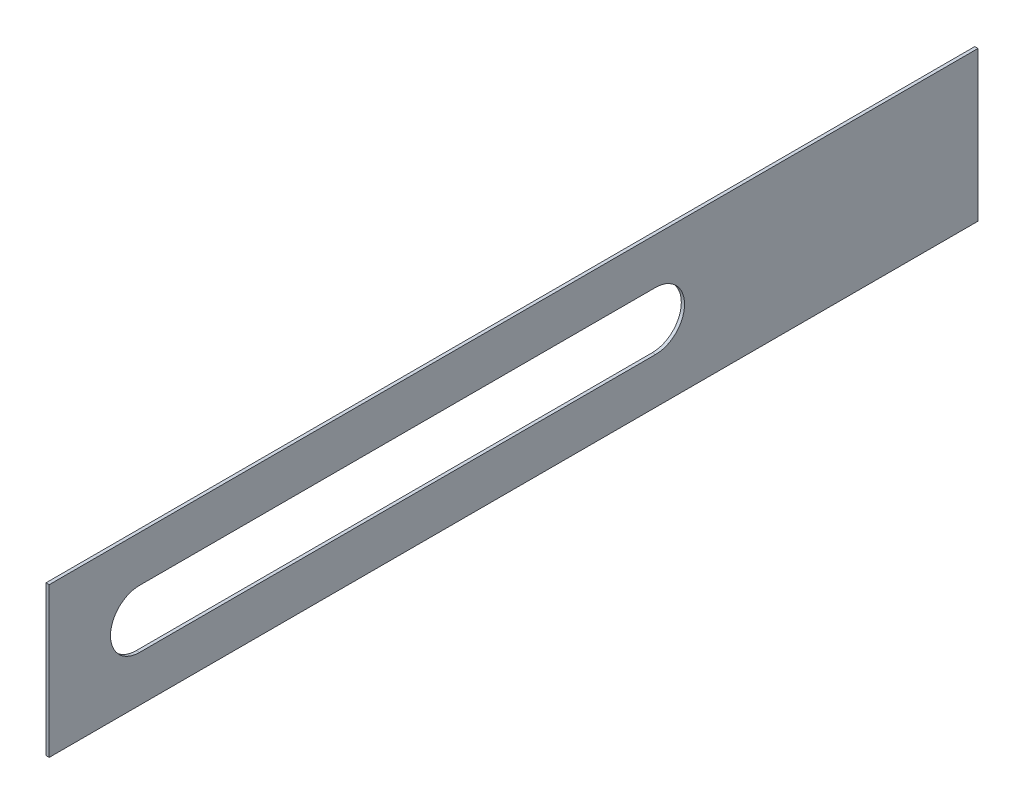
ISO-10303-21;
HEADER;
FILE_DESCRIPTION(('STEP AP214'),'2;1');
FILE_NAME('part.step','',(''),(''),'','','');
FILE_SCHEMA(('AUTOMOTIVE_DESIGN { 1 0 10303 214 1 1 1 1 }'));
ENDSEC;
DATA;
#1=APPLICATION_CONTEXT('core data for automotive mechanical design processes');
#2=APPLICATION_PROTOCOL_DEFINITION('international standard','automotive_design',2000,#1);
#3=PRODUCT_CONTEXT('',#1,'mechanical');
#4=PRODUCT('Part','Part','',(#3));
#5=PRODUCT_RELATED_PRODUCT_CATEGORY('part','',(#4));
#6=PRODUCT_DEFINITION_FORMATION('','',#4);
#7=PRODUCT_DEFINITION_CONTEXT('part definition',#1,'design');
#8=PRODUCT_DEFINITION('design','',#6,#7);
#9=PRODUCT_DEFINITION_SHAPE('','',#8);
#10=(LENGTH_UNIT() NAMED_UNIT(*) SI_UNIT(.MILLI.,.METRE.));
#11=(NAMED_UNIT(*) PLANE_ANGLE_UNIT() SI_UNIT($,.RADIAN.));
#12=(NAMED_UNIT(*) SI_UNIT($,.STERADIAN.) SOLID_ANGLE_UNIT());
#13=UNCERTAINTY_MEASURE_WITH_UNIT(LENGTH_MEASURE(1.E-05),#10,'distance_accuracy_value','');
#14=(GEOMETRIC_REPRESENTATION_CONTEXT(3) GLOBAL_UNCERTAINTY_ASSIGNED_CONTEXT((#13)) GLOBAL_UNIT_ASSIGNED_CONTEXT((#10,
#11,#12)) REPRESENTATION_CONTEXT('',''));
#15=CARTESIAN_POINT('',(0.,0.,0.));
#16=DIRECTION('',(0.,0.,1.));
#17=DIRECTION('',(1.,0.,0.));
#18=AXIS2_PLACEMENT_3D('',#15,#16,#17);
#19=CARTESIAN_POINT('',(255.16572497106,-1.32005517627934E-10,914.4));
#20=DIRECTION('',(1.,0.,0.));
#21=DIRECTION('',(0.,0.,-1.));
#22=AXIS2_PLACEMENT_3D('',#19,#20,#21);
#23=PLANE('',#22);
#24=CARTESIAN_POINT('',(255.16572497105,9.67586371213278E-11,635.));
#25=DIRECTION('',(-1.,0.,0.));
#26=DIRECTION('',(0.,0.,1.));
#27=AXIS2_PLACEMENT_3D('',#24,#25,#26);
#28=CIRCLE('',#27,57.15);
#29=CARTESIAN_POINT('',(255.16572497105,-57.1499999998984,635.));
#30=VERTEX_POINT('',#29);
#31=CARTESIAN_POINT('',(255.16572497105,57.1500000001016,635.000000000127));
#32=VERTEX_POINT('',#31);
#33=EDGE_CURVE('E19',#30,#32,#28,.F.);
#34=ORIENTED_EDGE('',*,*,#33,.T.);
#35=DIRECTION('',(0.,0.,1.));
#36=VECTOR('',#35,1.);
#37=CARTESIAN_POINT('',(255.16572497105,57.1500000001016,1084.10073280334));
#38=LINE('',#37,#36);
#39=CARTESIAN_POINT('',(255.165724971192,57.1500000001016,1650.99999999987));
#40=VERTEX_POINT('',#39);
#41=EDGE_CURVE('E100',#32,#40,#38,.T.);
#42=ORIENTED_EDGE('',*,*,#41,.T.);
#43=CARTESIAN_POINT('',(255.165724971334,9.64299345429456E-11,1651.));
#44=DIRECTION('',(-1.,0.,0.));
#45=DIRECTION('',(0.,0.,1.));
#46=AXIS2_PLACEMENT_3D('',#43,#44,#45);
#47=CIRCLE('',#46,57.15);
#48=CARTESIAN_POINT('',(255.165724971192,-57.1499999998997,1651.));
#49=VERTEX_POINT('',#48);
#50=EDGE_CURVE('E115',#40,#49,#47,.F.);
#51=ORIENTED_EDGE('',*,*,#50,.T.);
#52=DIRECTION('',(0.,0.,1.));
#53=VECTOR('',#52,1.);
#54=CARTESIAN_POINT('',(255.16572497105,-57.1499999998984,1084.10073280334));
#55=LINE('',#54,#53);
#56=EDGE_CURVE('E105',#30,#49,#55,.T.);
#57=ORIENTED_EDGE('',*,*,#56,.F.);
#58=EDGE_LOOP('',(#34,#42,#51,#57));
#59=FACE_BOUND('',#58,.T.);
#60=DIRECTION('',(0.,1.,0.));
#61=VECTOR('',#60,1.);
#62=CARTESIAN_POINT('',(255.16572497106,-500000.000000032,1828.8));
#63=LINE('',#62,#61);
#64=CARTESIAN_POINT('',(255.16572497106,147.319999999976,1828.8));
#65=VERTEX_POINT('',#64);
#66=CARTESIAN_POINT('',(255.16572497106,-147.32000000008,1828.8));
#67=VERTEX_POINT('',#66);
#68=EDGE_CURVE('E131',#65,#67,#63,.F.);
#69=ORIENTED_EDGE('',*,*,#68,.F.);
#70=DIRECTION('',(0.,0.,1.));
#71=VECTOR('',#70,1.);
#72=CARTESIAN_POINT('',(255.16572497106,147.319999999975,1808.3229528099));
#73=LINE('',#72,#71);
#74=CARTESIAN_POINT('',(255.16572497106,147.319999999975,0.));
#75=VERTEX_POINT('',#74);
#76=EDGE_CURVE('E88',#75,#65,#73,.T.);
#77=ORIENTED_EDGE('',*,*,#76,.F.);
#78=DIRECTION('',(0.,1.,0.));
#79=VECTOR('',#78,1.);
#80=CARTESIAN_POINT('',(255.16572497106,21.4565362286324,0.));
#81=LINE('',#80,#79);
#82=CARTESIAN_POINT('',(255.16572497106,-147.320000000057,0.));
#83=VERTEX_POINT('',#82);
#84=EDGE_CURVE('E86',#75,#83,#81,.F.);
#85=ORIENTED_EDGE('',*,*,#84,.T.);
#86=DIRECTION('',(0.,0.,1.));
#87=VECTOR('',#86,1.);
#88=CARTESIAN_POINT('',(255.16572497106,-147.320000000025,1808.3229528099));
#89=LINE('',#88,#87);
#90=EDGE_CURVE('E65',#83,#67,#89,.T.);
#91=ORIENTED_EDGE('',*,*,#90,.T.);
#92=EDGE_LOOP('',(#69,#77,#85,#91));
#93=FACE_BOUND('',#92,.T.);
#94=ADVANCED_FACE('F16',(#59,#93),#23,.F.);
#95=CARTESIAN_POINT('',(261.51572497106,-147.320000000025,1808.3229528099));
#96=DIRECTION('',(0.,1.,0.));
#97=DIRECTION('',(0.,0.,1.));
#98=AXIS2_PLACEMENT_3D('',#95,#96,#97);
#99=PLANE('',#98);
#100=DIRECTION('',(1.,0.,0.));
#101=VECTOR('',#100,1.);
#102=CARTESIAN_POINT('',(261.51572497106,-147.320000000076,0.));
#103=LINE('',#102,#101);
#104=CARTESIAN_POINT('',(261.51572497106,-147.320000000044,0.));
#105=VERTEX_POINT('',#104);
#106=EDGE_CURVE('E79',#83,#105,#103,.T.);
#107=ORIENTED_EDGE('',*,*,#106,.T.);
#108=DIRECTION('',(0.,0.,-1.));
#109=VECTOR('',#108,1.);
#110=CARTESIAN_POINT('',(261.51572497106,-147.320000000051,914.4));
#111=LINE('',#110,#109);
#112=CARTESIAN_POINT('',(261.51572497106,-147.320000000049,1828.8));
#113=VERTEX_POINT('',#112);
#114=EDGE_CURVE('E103',#113,#105,#111,.T.);
#115=ORIENTED_EDGE('',*,*,#114,.F.);
#116=DIRECTION('',(1.,0.,0.));
#117=VECTOR('',#116,1.);
#118=CARTESIAN_POINT('',(261.515724970552,-147.320000000093,1828.8));
#119=LINE('',#118,#117);
#120=EDGE_CURVE('E82',#67,#113,#119,.T.);
#121=ORIENTED_EDGE('',*,*,#120,.F.);
#122=ORIENTED_EDGE('',*,*,#90,.F.);
#123=EDGE_LOOP('',(#107,#115,#121,#122));
#124=FACE_BOUND('',#123,.T.);
#125=ADVANCED_FACE('F75',(#124),#99,.F.);
#126=CARTESIAN_POINT('',(261.51572497106,21.4565362286324,0.));
#127=DIRECTION('',(0.,0.,1.));
#128=DIRECTION('',(1.,0.,0.));
#129=AXIS2_PLACEMENT_3D('',#126,#127,#128);
#130=PLANE('',#129);
#131=DIRECTION('',(1.,0.,0.));
#132=VECTOR('',#131,1.);
#133=CARTESIAN_POINT('',(261.51572497106,147.319999999975,0.));
#134=LINE('',#133,#132);
#135=CARTESIAN_POINT('',(261.51572497106,147.319999999975,0.));
#136=VERTEX_POINT('',#135);
#137=EDGE_CURVE('E133',#136,#75,#134,.F.);
#138=ORIENTED_EDGE('',*,*,#137,.F.);
#139=DIRECTION('',(0.,1.,0.));
#140=VECTOR('',#139,1.);
#141=CARTESIAN_POINT('',(261.51572497106,-1.32019395415748E-10,0.));
#142=LINE('',#141,#140);
#143=EDGE_CURVE('E95',#105,#136,#142,.T.);
#144=ORIENTED_EDGE('',*,*,#143,.F.);
#145=ORIENTED_EDGE('',*,*,#106,.F.);
#146=ORIENTED_EDGE('',*,*,#84,.F.);
#147=EDGE_LOOP('',(#138,#144,#145,#146));
#148=FACE_BOUND('',#147,.T.);
#149=ADVANCED_FACE('F93',(#148),#130,.F.);
#150=CARTESIAN_POINT('',(261.51572497106,147.319999999975,1808.3229528099));
#151=DIRECTION('',(0.,1.,0.));
#152=DIRECTION('',(0.,0.,1.));
#153=AXIS2_PLACEMENT_3D('',#150,#151,#152);
#154=PLANE('',#153);
#155=DIRECTION('',(0.,0.,-1.));
#156=VECTOR('',#155,1.);
#157=CARTESIAN_POINT('',(261.51572497106,147.319999999975,914.4));
#158=LINE('',#157,#156);
#159=CARTESIAN_POINT('',(261.51572497106,147.319999999976,1828.8));
#160=VERTEX_POINT('',#159);
#161=EDGE_CURVE('E147',#136,#160,#158,.F.);
#162=ORIENTED_EDGE('',*,*,#161,.F.);
#163=ORIENTED_EDGE('',*,*,#137,.T.);
#164=ORIENTED_EDGE('',*,*,#76,.T.);
#165=DIRECTION('',(1.,0.,0.));
#166=VECTOR('',#165,1.);
#167=CARTESIAN_POINT('',(261.515724970552,147.319999999979,1828.8));
#168=LINE('',#167,#166);
#169=EDGE_CURVE('E127',#160,#65,#168,.F.);
#170=ORIENTED_EDGE('',*,*,#169,.F.);
#171=EDGE_LOOP('',(#162,#163,#164,#170));
#172=FACE_BOUND('',#171,.T.);
#173=ADVANCED_FACE('F137',(#172),#154,.T.);
#174=CARTESIAN_POINT('',(261.515724970552,-500000.000000032,1828.8));
#175=DIRECTION('',(0.,0.,1.));
#176=DIRECTION('',(1.,0.,0.));
#177=AXIS2_PLACEMENT_3D('',#174,#175,#176);
#178=PLANE('',#177);
#179=DIRECTION('',(0.,1.,0.));
#180=VECTOR('',#179,1.);
#181=CARTESIAN_POINT('',(261.51572497106,-1.32019395415748E-10,1828.8));
#182=LINE('',#181,#180);
#183=EDGE_CURVE('E114',#160,#113,#182,.F.);
#184=ORIENTED_EDGE('',*,*,#183,.F.);
#185=ORIENTED_EDGE('',*,*,#169,.T.);
#186=ORIENTED_EDGE('',*,*,#68,.T.);
#187=ORIENTED_EDGE('',*,*,#120,.T.);
#188=EDGE_LOOP('',(#184,#185,#186,#187));
#189=FACE_BOUND('',#188,.T.);
#190=ADVANCED_FACE('F140',(#189),#178,.T.);
#191=CARTESIAN_POINT('',(-500000.000000032,9.67586371213278E-11,635.));
#192=DIRECTION('',(-1.,0.,0.));
#193=DIRECTION('',(0.,0.,1.));
#194=AXIS2_PLACEMENT_3D('',#191,#192,#193);
#195=CYLINDRICAL_SURFACE('',#194,57.15);
#196=DIRECTION('',(1.,0.,0.));
#197=VECTOR('',#196,1.);
#198=CARTESIAN_POINT('',(-500000.000000032,-57.1499999998984,635.));
#199=LINE('',#198,#197);
#200=CARTESIAN_POINT('',(261.515724971193,-57.1499999998984,635.));
#201=VERTEX_POINT('',#200);
#202=EDGE_CURVE('E108',#201,#30,#199,.F.);
#203=ORIENTED_EDGE('',*,*,#202,.F.);
#204=CARTESIAN_POINT('',(261.515724971332,9.67586371213278E-11,635.));
#205=DIRECTION('',(-1.,0.,0.));
#206=DIRECTION('',(0.,0.,1.));
#207=AXIS2_PLACEMENT_3D('',#204,#205,#206);
#208=CIRCLE('',#207,57.15);
#209=CARTESIAN_POINT('',(261.515724971193,57.1500000000064,635.000000000127));
#210=VERTEX_POINT('',#209);
#211=EDGE_CURVE('E112',#210,#201,#208,.T.);
#212=ORIENTED_EDGE('',*,*,#211,.F.);
#213=DIRECTION('',(1.,0.,0.));
#214=VECTOR('',#213,1.);
#215=CARTESIAN_POINT('',(-500000.000000032,57.1500000001016,635.000000000254));
#216=LINE('',#215,#214);
#217=EDGE_CURVE('E104',#210,#32,#216,.F.);
#218=ORIENTED_EDGE('',*,*,#217,.T.);
#219=ORIENTED_EDGE('',*,*,#33,.F.);
#220=EDGE_LOOP('',(#203,#212,#218,#219));
#221=FACE_BOUND('',#220,.T.);
#222=ADVANCED_FACE('F158',(#221),#195,.F.);
#223=CARTESIAN_POINT('',(-500000.000000032,-57.1499999998984,1084.10073280334));
#224=DIRECTION('',(0.,1.,0.));
#225=DIRECTION('',(0.,0.,1.));
#226=AXIS2_PLACEMENT_3D('',#223,#224,#225);
#227=PLANE('',#226);
#228=ORIENTED_EDGE('',*,*,#202,.T.);
#229=ORIENTED_EDGE('',*,*,#56,.T.);
#230=DIRECTION('',(-1.,0.,0.));
#231=VECTOR('',#230,1.);
#232=CARTESIAN_POINT('',(-500000.000000032,-57.1499999999036,1651.));
#233=LINE('',#232,#231);
#234=CARTESIAN_POINT('',(261.515724971193,-57.1499999998997,1651.));
#235=VERTEX_POINT('',#234);
#236=EDGE_CURVE('E107',#49,#235,#233,.F.);
#237=ORIENTED_EDGE('',*,*,#236,.T.);
#238=DIRECTION('',(0.,0.,-1.));
#239=VECTOR('',#238,1.);
#240=CARTESIAN_POINT('',(261.51572497106,-57.1499999998984,914.4));
#241=LINE('',#240,#239);
#242=EDGE_CURVE('E111',#201,#235,#241,.F.);
#243=ORIENTED_EDGE('',*,*,#242,.F.);
#244=EDGE_LOOP('',(#228,#229,#237,#243));
#245=FACE_BOUND('',#244,.T.);
#246=ADVANCED_FACE('F165',(#245),#227,.T.);
#247=CARTESIAN_POINT('',(-500000.000000032,9.64299345429456E-11,1651.));
#248=DIRECTION('',(-1.,0.,0.));
#249=DIRECTION('',(0.,0.,1.));
#250=AXIS2_PLACEMENT_3D('',#247,#248,#249);
#251=CYLINDRICAL_SURFACE('',#250,57.15);
#252=DIRECTION('',(1.,0.,0.));
#253=VECTOR('',#252,1.);
#254=CARTESIAN_POINT('',(-500000.000000032,57.1500000001016,1650.99999999975));
#255=LINE('',#254,#253);
#256=CARTESIAN_POINT('',(261.515724971193,57.1500000000064,1650.99999999987));
#257=VERTEX_POINT('',#256);
#258=EDGE_CURVE('E34',#40,#257,#255,.T.);
#259=ORIENTED_EDGE('',*,*,#258,.T.);
#260=CARTESIAN_POINT('',(261.515724971332,9.64299345429456E-11,1651.));
#261=DIRECTION('',(-1.,0.,0.));
#262=DIRECTION('',(0.,0.,1.));
#263=AXIS2_PLACEMENT_3D('',#260,#261,#262);
#264=CIRCLE('',#263,57.15);
#265=EDGE_CURVE('E25',#235,#257,#264,.T.);
#266=ORIENTED_EDGE('',*,*,#265,.F.);
#267=ORIENTED_EDGE('',*,*,#236,.F.);
#268=ORIENTED_EDGE('',*,*,#50,.F.);
#269=EDGE_LOOP('',(#259,#266,#267,#268));
#270=FACE_BOUND('',#269,.T.);
#271=ADVANCED_FACE('F163',(#270),#251,.F.);
#272=CARTESIAN_POINT('',(-500000.000000032,57.1500000001016,1084.10073280334));
#273=DIRECTION('',(0.,1.,0.));
#274=DIRECTION('',(0.,0.,1.));
#275=AXIS2_PLACEMENT_3D('',#272,#273,#274);
#276=PLANE('',#275);
#277=ORIENTED_EDGE('',*,*,#217,.F.);
#278=DIRECTION('',(0.,0.,-1.));
#279=VECTOR('',#278,1.);
#280=CARTESIAN_POINT('',(261.51572497106,57.1499999999746,914.4));
#281=LINE('',#280,#279);
#282=EDGE_CURVE('E11',#257,#210,#281,.T.);
#283=ORIENTED_EDGE('',*,*,#282,.F.);
#284=ORIENTED_EDGE('',*,*,#258,.F.);
#285=ORIENTED_EDGE('',*,*,#41,.F.);
#286=EDGE_LOOP('',(#277,#283,#284,#285));
#287=FACE_BOUND('',#286,.T.);
#288=ADVANCED_FACE('F160',(#287),#276,.F.);
#289=CARTESIAN_POINT('',(261.51572497106,-1.32019395415748E-10,914.4));
#290=DIRECTION('',(1.,0.,0.));
#291=DIRECTION('',(0.,0.,-1.));
#292=AXIS2_PLACEMENT_3D('',#289,#290,#291);
#293=PLANE('',#292);
#294=ORIENTED_EDGE('',*,*,#265,.T.);
#295=ORIENTED_EDGE('',*,*,#282,.T.);
#296=ORIENTED_EDGE('',*,*,#211,.T.);
#297=ORIENTED_EDGE('',*,*,#242,.T.);
#298=EDGE_LOOP('',(#294,#295,#296,#297));
#299=FACE_BOUND('',#298,.T.);
#300=ORIENTED_EDGE('',*,*,#161,.T.);
#301=ORIENTED_EDGE('',*,*,#183,.T.);
#302=ORIENTED_EDGE('',*,*,#114,.T.);
#303=ORIENTED_EDGE('',*,*,#143,.T.);
#304=EDGE_LOOP('',(#300,#301,#302,#303));
#305=FACE_BOUND('',#304,.T.);
#306=ADVANCED_FACE('F149',(#299,#305),#293,.T.);
#307=CLOSED_SHELL('',(#94,#125,#149,#173,#190,#222,#246,#271,#288,#306));
#308=MANIFOLD_SOLID_BREP('B1',#307);
#309=ADVANCED_BREP_SHAPE_REPRESENTATION('',(#18,#308),#14);
#310=SHAPE_DEFINITION_REPRESENTATION(#9,#309);
ENDSEC;
END-ISO-10303-21;
